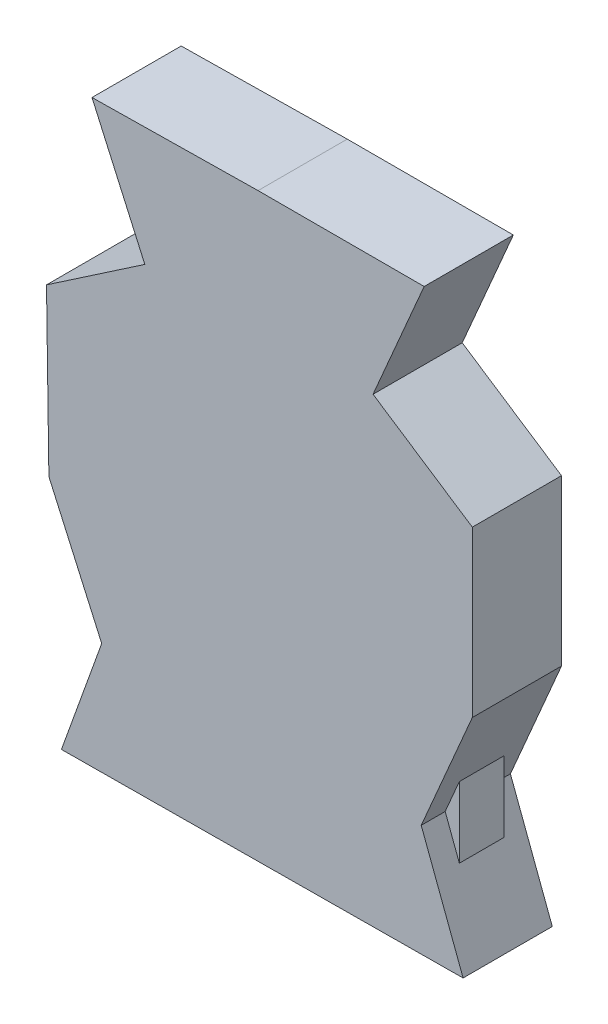
ISO-10303-21;
HEADER;
FILE_DESCRIPTION(('STEP AP214'),'2;1');
FILE_NAME('part.step','',(''),(''),'','','');
FILE_SCHEMA(('AUTOMOTIVE_DESIGN { 1 0 10303 214 1 1 1 1 }'));
ENDSEC;
DATA;
#1=APPLICATION_CONTEXT('core data for automotive mechanical design processes');
#2=APPLICATION_PROTOCOL_DEFINITION('international standard','automotive_design',2000,#1);
#3=PRODUCT_CONTEXT('',#1,'mechanical');
#4=PRODUCT('Part','Part','',(#3));
#5=PRODUCT_RELATED_PRODUCT_CATEGORY('part','',(#4));
#6=PRODUCT_DEFINITION_FORMATION('','',#4);
#7=PRODUCT_DEFINITION_CONTEXT('part definition',#1,'design');
#8=PRODUCT_DEFINITION('design','',#6,#7);
#9=PRODUCT_DEFINITION_SHAPE('','',#8);
#10=(LENGTH_UNIT() NAMED_UNIT(*) SI_UNIT(.MILLI.,.METRE.));
#11=(NAMED_UNIT(*) PLANE_ANGLE_UNIT() SI_UNIT($,.RADIAN.));
#12=(NAMED_UNIT(*) SI_UNIT($,.STERADIAN.) SOLID_ANGLE_UNIT());
#13=UNCERTAINTY_MEASURE_WITH_UNIT(LENGTH_MEASURE(1.E-05),#10,'distance_accuracy_value','');
#14=(GEOMETRIC_REPRESENTATION_CONTEXT(3) GLOBAL_UNCERTAINTY_ASSIGNED_CONTEXT((#13)) GLOBAL_UNIT_ASSIGNED_CONTEXT((#10,
#11,#12)) REPRESENTATION_CONTEXT('',''));
#15=CARTESIAN_POINT('',(0.,0.,0.));
#16=DIRECTION('',(0.,0.,1.));
#17=DIRECTION('',(1.,0.,0.));
#18=AXIS2_PLACEMENT_3D('',#15,#16,#17);
#19=CARTESIAN_POINT('',(19.2258651036182,-108.485610583333,30.));
#20=DIRECTION('',(-0.935884627526308,-0.352306633431652,0.));
#21=DIRECTION('',(0.352306633431652,-0.935884627526308,0.));
#22=AXIS2_PLACEMENT_3D('',#19,#20,#21);
#23=PLANE('',#22);
#24=DIRECTION('',(-0.352306633431652,0.935884627526308,0.));
#25=VECTOR('',#24,1.);
#26=CARTESIAN_POINT('',(19.2258651036182,-108.485610583333,6.94150678656227));
#27=LINE('',#26,#25);
#28=CARTESIAN_POINT('',(24.0000000000001,-121.167856772511,6.94150678656227));
#29=VERTEX_POINT('',#28);
#30=CARTESIAN_POINT('',(19.2258651036182,-108.485610583333,6.94150678656227));
#31=VERTEX_POINT('',#30);
#32=EDGE_CURVE('E48',#29,#31,#27,.T.);
#33=ORIENTED_EDGE('',*,*,#32,.F.);
#34=DIRECTION('',(0.,0.,-1.));
#35=VECTOR('',#34,1.);
#36=CARTESIAN_POINT('',(24.0000000000001,-121.167856772511,30.));
#37=LINE('',#36,#35);
#38=CARTESIAN_POINT('',(24.0000000000001,-121.167856772511,21.9415067865623));
#39=VERTEX_POINT('',#38);
#40=EDGE_CURVE('E52',#39,#29,#37,.T.);
#41=ORIENTED_EDGE('',*,*,#40,.F.);
#42=DIRECTION('',(0.352306633431652,-0.935884627526308,0.));
#43=VECTOR('',#42,1.);
#44=CARTESIAN_POINT('',(19.2258651036182,-108.485610583333,21.9415067865623));
#45=LINE('',#44,#43);
#46=CARTESIAN_POINT('',(19.2258651036182,-108.485610583333,21.9415067865623));
#47=VERTEX_POINT('',#46);
#48=EDGE_CURVE('E163',#47,#39,#45,.T.);
#49=ORIENTED_EDGE('',*,*,#48,.F.);
#50=DIRECTION('',(0.,0.,-1.));
#51=VECTOR('',#50,1.);
#52=CARTESIAN_POINT('',(19.2258651036182,-108.485610583333,30.));
#53=LINE('',#52,#51);
#54=CARTESIAN_POINT('',(19.2258651036182,-108.485610583333,30.));
#55=VERTEX_POINT('',#54);
#56=EDGE_CURVE('E150',#55,#47,#53,.T.);
#57=ORIENTED_EDGE('',*,*,#56,.F.);
#58=DIRECTION('',(-0.352306633431652,0.935884627526308,0.));
#59=VECTOR('',#58,1.);
#60=CARTESIAN_POINT('',(19.2258651036182,-108.485610583333,30.));
#61=LINE('',#60,#59);
#62=CARTESIAN_POINT('',(33.3181304408842,-145.920995684385,30.));
#63=VERTEX_POINT('',#62);
#64=EDGE_CURVE('E187',#63,#55,#61,.T.);
#65=ORIENTED_EDGE('',*,*,#64,.F.);
#66=DIRECTION('',(0.,0.,-1.));
#67=VECTOR('',#66,1.);
#68=CARTESIAN_POINT('',(33.3181304408842,-145.920995684385,30.));
#69=LINE('',#68,#67);
#70=CARTESIAN_POINT('',(33.3181304408842,-145.920995684385,0.));
#71=VERTEX_POINT('',#70);
#72=EDGE_CURVE('E242',#63,#71,#69,.T.);
#73=ORIENTED_EDGE('',*,*,#72,.T.);
#74=DIRECTION('',(-0.352306633431652,0.935884627526308,0.));
#75=VECTOR('',#74,1.);
#76=CARTESIAN_POINT('',(19.2258651036182,-108.485610583333,0.));
#77=LINE('',#76,#75);
#78=CARTESIAN_POINT('',(19.2258651036182,-108.485610583333,0.));
#79=VERTEX_POINT('',#78);
#80=EDGE_CURVE('E214',#71,#79,#77,.T.);
#81=ORIENTED_EDGE('',*,*,#80,.T.);
#82=EDGE_CURVE('E240',#31,#79,#53,.T.);
#83=ORIENTED_EDGE('',*,*,#82,.F.);
#84=EDGE_LOOP('',(#33,#41,#49,#57,#65,#73,#81,#83));
#85=FACE_BOUND('',#84,.T.);
#86=ADVANCED_FACE('F33',(#85),#23,.F.);
#87=CARTESIAN_POINT('',(36.4175876407539,-68.4856105833332,30.));
#88=DIRECTION('',(-0.918738168273325,0.394867291830782,0.));
#89=DIRECTION('',(-0.394867291830782,-0.918738168273325,0.));
#90=AXIS2_PLACEMENT_3D('',#87,#88,#89);
#91=PLANE('',#90);
#92=DIRECTION('',(0.394867291830782,0.918738168273325,0.));
#93=VECTOR('',#92,1.);
#94=CARTESIAN_POINT('',(36.4175876407539,-68.4856105833332,6.94150678656227));
#95=LINE('',#94,#93);
#96=CARTESIAN_POINT('',(24.0000000000001,-97.377625595629,6.94150678656227));
#97=VERTEX_POINT('',#96);
#98=EDGE_CURVE('E11',#31,#97,#95,.T.);
#99=ORIENTED_EDGE('',*,*,#98,.F.);
#100=ORIENTED_EDGE('',*,*,#82,.T.);
#101=DIRECTION('',(0.394867291830782,0.918738168273325,0.));
#102=VECTOR('',#101,1.);
#103=CARTESIAN_POINT('',(36.4175876407539,-68.4856105833332,0.));
#104=LINE('',#103,#102);
#105=CARTESIAN_POINT('',(36.4175876407539,-68.4856105833332,0.));
#106=VERTEX_POINT('',#105);
#107=EDGE_CURVE('E217',#79,#106,#104,.T.);
#108=ORIENTED_EDGE('',*,*,#107,.T.);
#109=DIRECTION('',(0.,0.,-1.));
#110=VECTOR('',#109,1.);
#111=CARTESIAN_POINT('',(36.4175876407539,-68.4856105833332,30.));
#112=LINE('',#111,#110);
#113=CARTESIAN_POINT('',(36.4175876407539,-68.4856105833332,30.));
#114=VERTEX_POINT('',#113);
#115=EDGE_CURVE('E237',#114,#106,#112,.T.);
#116=ORIENTED_EDGE('',*,*,#115,.F.);
#117=DIRECTION('',(0.394867291830782,0.918738168273325,0.));
#118=VECTOR('',#117,1.);
#119=CARTESIAN_POINT('',(36.4175876407539,-68.4856105833332,30.));
#120=LINE('',#119,#118);
#121=EDGE_CURVE('E189',#55,#114,#120,.T.);
#122=ORIENTED_EDGE('',*,*,#121,.F.);
#123=ORIENTED_EDGE('',*,*,#56,.T.);
#124=DIRECTION('',(-0.394867291830782,-0.918738168273325,0.));
#125=VECTOR('',#124,1.);
#126=CARTESIAN_POINT('',(36.4175876407539,-68.4856105833332,21.9415067865623));
#127=LINE('',#126,#125);
#128=CARTESIAN_POINT('',(24.0000000000001,-97.377625595629,21.9415067865623));
#129=VERTEX_POINT('',#128);
#130=EDGE_CURVE('E41',#129,#47,#127,.T.);
#131=ORIENTED_EDGE('',*,*,#130,.F.);
#132=DIRECTION('',(0.,0.,1.));
#133=VECTOR('',#132,1.);
#134=CARTESIAN_POINT('',(24.0000000000001,-97.377625595629,30.));
#135=LINE('',#134,#133);
#136=EDGE_CURVE('E147',#97,#129,#135,.T.);
#137=ORIENTED_EDGE('',*,*,#136,.F.);
#138=EDGE_LOOP('',(#99,#100,#108,#116,#122,#123,#131,#137));
#139=FACE_BOUND('',#138,.T.);
#140=ADVANCED_FACE('F146',(#139),#91,.F.);
#141=CARTESIAN_POINT('',(-91.5246396923902,48.1857808875972,30.));
#142=DIRECTION('',(0.0144687106700426,-0.999895322727107,0.));
#143=DIRECTION('',(0.999895322727108,0.0144687106700426,0.));
#144=AXIS2_PLACEMENT_3D('',#141,#142,#143);
#145=PLANE('',#144);
#146=DIRECTION('',(-0.999895322727107,-0.0144687106700426,0.));
#147=VECTOR('',#146,1.);
#148=CARTESIAN_POINT('',(-91.5246396923902,48.1857808875972,0.));
#149=LINE('',#148,#147);
#150=CARTESIAN_POINT('',(-35.6592204405538,48.9941660947716,0.));
#151=VERTEX_POINT('',#150);
#152=CARTESIAN_POINT('',(-91.5246396923902,48.1857808875972,0.));
#153=VERTEX_POINT('',#152);
#154=EDGE_CURVE('E170',#151,#153,#149,.T.);
#155=ORIENTED_EDGE('',*,*,#154,.T.);
#156=DIRECTION('',(0.,0.,-1.));
#157=VECTOR('',#156,1.);
#158=CARTESIAN_POINT('',(-91.5246396923902,48.1857808875972,30.));
#159=LINE('',#158,#157);
#160=CARTESIAN_POINT('',(-91.5246396923902,48.1857808875972,30.));
#161=VERTEX_POINT('',#160);
#162=EDGE_CURVE('E160',#161,#153,#159,.T.);
#163=ORIENTED_EDGE('',*,*,#162,.F.);
#164=DIRECTION('',(-0.999895322727107,-0.0144687106700426,0.));
#165=VECTOR('',#164,1.);
#166=CARTESIAN_POINT('',(-91.5246396923902,48.1857808875972,30.));
#167=LINE('',#166,#165);
#168=CARTESIAN_POINT('',(-35.6592204405538,48.9941660947716,30.));
#169=VERTEX_POINT('',#168);
#170=EDGE_CURVE('E171',#169,#161,#167,.T.);
#171=ORIENTED_EDGE('',*,*,#170,.F.);
#172=DIRECTION('',(0.,0.,-1.));
#173=VECTOR('',#172,1.);
#174=CARTESIAN_POINT('',(-35.6592204405538,48.9941660947716,30.));
#175=LINE('',#174,#173);
#176=EDGE_CURVE('E199',#169,#151,#175,.T.);
#177=ORIENTED_EDGE('',*,*,#176,.T.);
#178=EDGE_LOOP('',(#155,#163,#171,#177));
#179=FACE_BOUND('',#178,.T.);
#180=ADVANCED_FACE('F35',(#179),#145,.F.);
#181=CARTESIAN_POINT('',(-91.5246396923902,48.1857808875972,30.));
#182=DIRECTION('',(0.912928776668804,0.408118914937791,0.));
#183=DIRECTION('',(-0.408118914937791,0.912928776668805,0.));
#184=AXIS2_PLACEMENT_3D('',#181,#182,#183);
#185=PLANE('',#184);
#186=DIRECTION('',(0.408118914937791,-0.912928776668804,0.));
#187=VECTOR('',#186,1.);
#188=CARTESIAN_POINT('',(-91.5246396923902,48.1857808875972,0.));
#189=LINE('',#188,#187);
#190=CARTESIAN_POINT('',(-73.7559683110842,8.43871003782237,0.));
#191=VERTEX_POINT('',#190);
#192=EDGE_CURVE('E202',#153,#191,#189,.T.);
#193=ORIENTED_EDGE('',*,*,#192,.T.);
#194=DIRECTION('',(0.,0.,-1.));
#195=VECTOR('',#194,1.);
#196=CARTESIAN_POINT('',(-73.7559683110842,8.43871003782237,30.));
#197=LINE('',#196,#195);
#198=CARTESIAN_POINT('',(-73.7559683110842,8.43871003782237,30.));
#199=VERTEX_POINT('',#198);
#200=EDGE_CURVE('E257',#199,#191,#197,.T.);
#201=ORIENTED_EDGE('',*,*,#200,.F.);
#202=DIRECTION('',(0.408118914937791,-0.912928776668804,0.));
#203=VECTOR('',#202,1.);
#204=CARTESIAN_POINT('',(-91.5246396923902,48.1857808875972,30.));
#205=LINE('',#204,#203);
#206=EDGE_CURVE('E174',#161,#199,#205,.T.);
#207=ORIENTED_EDGE('',*,*,#206,.F.);
#208=ORIENTED_EDGE('',*,*,#162,.T.);
#209=EDGE_LOOP('',(#193,#201,#207,#208));
#210=FACE_BOUND('',#209,.T.);
#211=ADVANCED_FACE('F263',(#210),#185,.F.);
#212=CARTESIAN_POINT('',(-73.7559683110842,8.43871003782237,30.));
#213=DIRECTION('',(0.562376540625002,-0.82688126508868,0.));
#214=DIRECTION('',(0.82688126508868,0.562376540625002,0.));
#215=AXIS2_PLACEMENT_3D('',#212,#213,#214);
#216=PLANE('',#215);
#217=DIRECTION('',(-0.82688126508868,-0.562376540625002,0.));
#218=VECTOR('',#217,1.);
#219=CARTESIAN_POINT('',(-73.7559683110842,8.43871003782237,0.));
#220=LINE('',#219,#218);
#221=CARTESIAN_POINT('',(-106.831218914631,-14.0563515871777,0.));
#222=VERTEX_POINT('',#221);
#223=EDGE_CURVE('E204',#191,#222,#220,.T.);
#224=ORIENTED_EDGE('',*,*,#223,.T.);
#225=DIRECTION('',(0.,0.,-1.));
#226=VECTOR('',#225,1.);
#227=CARTESIAN_POINT('',(-106.831218914631,-14.0563515871777,30.));
#228=LINE('',#227,#226);
#229=CARTESIAN_POINT('',(-106.831218914631,-14.0563515871777,30.));
#230=VERTEX_POINT('',#229);
#231=EDGE_CURVE('E254',#230,#222,#228,.T.);
#232=ORIENTED_EDGE('',*,*,#231,.F.);
#233=DIRECTION('',(-0.82688126508868,-0.562376540625002,0.));
#234=VECTOR('',#233,1.);
#235=CARTESIAN_POINT('',(-73.7559683110842,8.43871003782237,30.));
#236=LINE('',#235,#234);
#237=EDGE_CURVE('E177',#199,#230,#236,.T.);
#238=ORIENTED_EDGE('',*,*,#237,.F.);
#239=ORIENTED_EDGE('',*,*,#200,.T.);
#240=EDGE_LOOP('',(#224,#232,#238,#239));
#241=FACE_BOUND('',#240,.T.);
#242=ADVANCED_FACE('F278',(#241),#216,.F.);
#243=CARTESIAN_POINT('',(-106.831218914631,-14.0563515871777,30.));
#244=DIRECTION('',(0.999895322727108,0.0144687106700407,0.));
#245=DIRECTION('',(-0.0144687106700407,0.999895322727108,0.));
#246=AXIS2_PLACEMENT_3D('',#243,#244,#245);
#247=PLANE('',#246);
#248=DIRECTION('',(0.0144687106700407,-0.999895322727108,0.));
#249=VECTOR('',#248,1.);
#250=CARTESIAN_POINT('',(-106.831218914631,-14.0563515871777,0.));
#251=LINE('',#250,#249);
#252=CARTESIAN_POINT('',(-106.028702819816,-69.5161716028391,0.));
#253=VERTEX_POINT('',#252);
#254=EDGE_CURVE('E206',#222,#253,#251,.T.);
#255=ORIENTED_EDGE('',*,*,#254,.T.);
#256=DIRECTION('',(0.,0.,-1.));
#257=VECTOR('',#256,1.);
#258=CARTESIAN_POINT('',(-106.028702819816,-69.5161716028391,30.));
#259=LINE('',#258,#257);
#260=CARTESIAN_POINT('',(-106.028702819816,-69.5161716028391,30.));
#261=VERTEX_POINT('',#260);
#262=EDGE_CURVE('E251',#261,#253,#259,.T.);
#263=ORIENTED_EDGE('',*,*,#262,.F.);
#264=DIRECTION('',(0.0144687106700407,-0.999895322727108,0.));
#265=VECTOR('',#264,1.);
#266=CARTESIAN_POINT('',(-106.831218914631,-14.0563515871777,30.));
#267=LINE('',#266,#265);
#268=EDGE_CURVE('E179',#230,#261,#267,.T.);
#269=ORIENTED_EDGE('',*,*,#268,.F.);
#270=ORIENTED_EDGE('',*,*,#231,.T.);
#271=EDGE_LOOP('',(#255,#263,#269,#270));
#272=FACE_BOUND('',#271,.T.);
#273=ADVANCED_FACE('F282',(#272),#247,.F.);
#274=CARTESIAN_POINT('',(-106.028702819816,-69.5161716028391,30.));
#275=DIRECTION('',(0.912928776668805,0.408118914937791,0.));
#276=DIRECTION('',(-0.408118914937791,0.912928776668805,0.));
#277=AXIS2_PLACEMENT_3D('',#274,#275,#276);
#278=PLANE('',#277);
#279=DIRECTION('',(0.408118914937791,-0.912928776668805,0.));
#280=VECTOR('',#279,1.);
#281=CARTESIAN_POINT('',(-106.028702819816,-69.5161716028391,0.));
#282=LINE('',#281,#280);
#283=CARTESIAN_POINT('',(-88.2600314385101,-109.263242452614,0.));
#284=VERTEX_POINT('',#283);
#285=EDGE_CURVE('E208',#253,#284,#282,.T.);
#286=ORIENTED_EDGE('',*,*,#285,.T.);
#287=DIRECTION('',(0.,0.,-1.));
#288=VECTOR('',#287,1.);
#289=CARTESIAN_POINT('',(-88.2600314385101,-109.263242452614,30.));
#290=LINE('',#289,#288);
#291=CARTESIAN_POINT('',(-88.2600314385101,-109.263242452614,30.));
#292=VERTEX_POINT('',#291);
#293=EDGE_CURVE('E248',#292,#284,#290,.T.);
#294=ORIENTED_EDGE('',*,*,#293,.F.);
#295=DIRECTION('',(0.408118914937791,-0.912928776668805,0.));
#296=VECTOR('',#295,1.);
#297=CARTESIAN_POINT('',(-106.028702819816,-69.5161716028391,30.));
#298=LINE('',#297,#296);
#299=EDGE_CURVE('E181',#261,#292,#298,.T.);
#300=ORIENTED_EDGE('',*,*,#299,.F.);
#301=ORIENTED_EDGE('',*,*,#262,.T.);
#302=EDGE_LOOP('',(#286,#294,#300,#301));
#303=FACE_BOUND('',#302,.T.);
#304=ADVANCED_FACE('F320',(#303),#278,.F.);
#305=CARTESIAN_POINT('',(-88.2600314385101,-109.263242452614,30.));
#306=DIRECTION('',(0.940884084422016,-0.338728711037824,0.));
#307=DIRECTION('',(0.338728711037824,0.940884084422016,0.));
#308=AXIS2_PLACEMENT_3D('',#305,#306,#307);
#309=PLANE('',#308);
#310=DIRECTION('',(-0.338728711037824,-0.940884084422016,0.));
#311=VECTOR('',#310,1.);
#312=CARTESIAN_POINT('',(-88.2600314385101,-109.263242452614,0.));
#313=LINE('',#312,#311);
#314=CARTESIAN_POINT('',(-101.809179880023,-146.898605829495,0.));
#315=VERTEX_POINT('',#314);
#316=EDGE_CURVE('E210',#284,#315,#313,.T.);
#317=ORIENTED_EDGE('',*,*,#316,.T.);
#318=DIRECTION('',(0.,0.,-1.));
#319=VECTOR('',#318,1.);
#320=CARTESIAN_POINT('',(-101.809179880023,-146.898605829495,30.));
#321=LINE('',#320,#319);
#322=CARTESIAN_POINT('',(-101.809179880023,-146.898605829495,30.));
#323=VERTEX_POINT('',#322);
#324=EDGE_CURVE('E245',#323,#315,#321,.T.);
#325=ORIENTED_EDGE('',*,*,#324,.F.);
#326=DIRECTION('',(-0.338728711037824,-0.940884084422016,0.));
#327=VECTOR('',#326,1.);
#328=CARTESIAN_POINT('',(-88.2600314385101,-109.263242452614,30.));
#329=LINE('',#328,#327);
#330=EDGE_CURVE('E183',#292,#323,#329,.T.);
#331=ORIENTED_EDGE('',*,*,#330,.F.);
#332=ORIENTED_EDGE('',*,*,#293,.T.);
#333=EDGE_LOOP('',(#317,#325,#331,#332));
#334=FACE_BOUND('',#333,.T.);
#335=ADVANCED_FACE('F318',(#334),#309,.F.);
#336=CARTESIAN_POINT('',(-101.809179880023,-146.898605829495,30.));
#337=DIRECTION('',(-0.00723454466060004,0.999973830339351,0.));
#338=DIRECTION('',(-0.999973830339351,-0.00723454466060004,0.));
#339=AXIS2_PLACEMENT_3D('',#336,#337,#338);
#340=PLANE('',#339);
#341=DIRECTION('',(0.999973830339351,0.00723454466060004,0.));
#342=VECTOR('',#341,1.);
#343=CARTESIAN_POINT('',(-101.809179880023,-146.898605829495,0.));
#344=LINE('',#343,#342);
#345=EDGE_CURVE('E212',#315,#71,#344,.T.);
#346=ORIENTED_EDGE('',*,*,#345,.T.);
#347=ORIENTED_EDGE('',*,*,#72,.F.);
#348=DIRECTION('',(0.999973830339351,0.00723454466060004,0.));
#349=VECTOR('',#348,1.);
#350=CARTESIAN_POINT('',(-101.809179880023,-146.898605829495,30.));
#351=LINE('',#350,#349);
#352=EDGE_CURVE('E185',#323,#63,#351,.T.);
#353=ORIENTED_EDGE('',*,*,#352,.F.);
#354=ORIENTED_EDGE('',*,*,#324,.T.);
#355=EDGE_LOOP('',(#346,#347,#353,#354));
#356=FACE_BOUND('',#355,.T.);
#357=ADVANCED_FACE('F314',(#356),#340,.F.);
#358=CARTESIAN_POINT('',(36.4175876407538,-13.0199845772022,30.));
#359=DIRECTION('',(-1.,0.,0.));
#360=DIRECTION('',(0.,-1.,0.));
#361=AXIS2_PLACEMENT_3D('',#358,#359,#360);
#362=PLANE('',#361);
#363=DIRECTION('',(0.,1.,0.));
#364=VECTOR('',#363,1.);
#365=CARTESIAN_POINT('',(36.4175876407538,-13.0199845772022,0.));
#366=LINE('',#365,#364);
#367=CARTESIAN_POINT('',(36.4175876407538,-13.0199845772022,0.));
#368=VERTEX_POINT('',#367);
#369=EDGE_CURVE('E219',#106,#368,#366,.T.);
#370=ORIENTED_EDGE('',*,*,#369,.T.);
#371=DIRECTION('',(0.,0.,-1.));
#372=VECTOR('',#371,1.);
#373=CARTESIAN_POINT('',(36.4175876407538,-13.0199845772022,30.));
#374=LINE('',#373,#372);
#375=CARTESIAN_POINT('',(36.4175876407538,-13.0199845772022,30.));
#376=VERTEX_POINT('',#375);
#377=EDGE_CURVE('E234',#376,#368,#374,.T.);
#378=ORIENTED_EDGE('',*,*,#377,.F.);
#379=DIRECTION('',(0.,1.,0.));
#380=VECTOR('',#379,1.);
#381=CARTESIAN_POINT('',(36.4175876407538,-13.0199845772022,30.));
#382=LINE('',#381,#380);
#383=EDGE_CURVE('E191',#114,#376,#382,.T.);
#384=ORIENTED_EDGE('',*,*,#383,.F.);
#385=ORIENTED_EDGE('',*,*,#115,.T.);
#386=EDGE_LOOP('',(#370,#378,#384,#385));
#387=FACE_BOUND('',#386,.T.);
#388=ADVANCED_FACE('F305',(#387),#362,.F.);
#389=CARTESIAN_POINT('',(3.02032472608309,8.99416609477159,30.));
#390=DIRECTION('',(-0.550353766799344,-0.834931572866767,0.));
#391=DIRECTION('',(0.834931572866767,-0.550353766799344,0.));
#392=AXIS2_PLACEMENT_3D('',#389,#390,#391);
#393=PLANE('',#392);
#394=DIRECTION('',(-0.834931572866767,0.550353766799344,0.));
#395=VECTOR('',#394,1.);
#396=CARTESIAN_POINT('',(3.02032472608309,8.99416609477159,0.));
#397=LINE('',#396,#395);
#398=CARTESIAN_POINT('',(3.02032472608309,8.99416609477159,0.));
#399=VERTEX_POINT('',#398);
#400=EDGE_CURVE('E221',#368,#399,#397,.T.);
#401=ORIENTED_EDGE('',*,*,#400,.T.);
#402=DIRECTION('',(0.,0.,-1.));
#403=VECTOR('',#402,1.);
#404=CARTESIAN_POINT('',(3.02032472608309,8.99416609477159,30.));
#405=LINE('',#404,#403);
#406=CARTESIAN_POINT('',(3.02032472608309,8.99416609477159,30.));
#407=VERTEX_POINT('',#406);
#408=EDGE_CURVE('E231',#407,#399,#405,.T.);
#409=ORIENTED_EDGE('',*,*,#408,.F.);
#410=DIRECTION('',(-0.834931572866767,0.550353766799344,0.));
#411=VECTOR('',#410,1.);
#412=CARTESIAN_POINT('',(3.02032472608309,8.99416609477159,30.));
#413=LINE('',#412,#411);
#414=EDGE_CURVE('E193',#376,#407,#413,.T.);
#415=ORIENTED_EDGE('',*,*,#414,.F.);
#416=ORIENTED_EDGE('',*,*,#377,.T.);
#417=EDGE_LOOP('',(#401,#409,#415,#416));
#418=FACE_BOUND('',#417,.T.);
#419=ADVANCED_FACE('F300',(#418),#393,.F.);
#420=CARTESIAN_POINT('',(20.2120472632188,48.9941660947716,30.));
#421=DIRECTION('',(-0.918738168273324,0.394867291830783,0.));
#422=DIRECTION('',(-0.394867291830783,-0.918738168273325,0.));
#423=AXIS2_PLACEMENT_3D('',#420,#421,#422);
#424=PLANE('',#423);
#425=DIRECTION('',(0.394867291830783,0.918738168273324,0.));
#426=VECTOR('',#425,1.);
#427=CARTESIAN_POINT('',(20.2120472632188,48.9941660947716,0.));
#428=LINE('',#427,#426);
#429=CARTESIAN_POINT('',(20.2120472632188,48.9941660947716,0.));
#430=VERTEX_POINT('',#429);
#431=EDGE_CURVE('E223',#399,#430,#428,.T.);
#432=ORIENTED_EDGE('',*,*,#431,.T.);
#433=DIRECTION('',(0.,0.,-1.));
#434=VECTOR('',#433,1.);
#435=CARTESIAN_POINT('',(20.2120472632188,48.9941660947716,30.));
#436=LINE('',#435,#434);
#437=CARTESIAN_POINT('',(20.2120472632188,48.9941660947716,30.));
#438=VERTEX_POINT('',#437);
#439=EDGE_CURVE('E228',#438,#430,#436,.T.);
#440=ORIENTED_EDGE('',*,*,#439,.F.);
#441=DIRECTION('',(0.394867291830783,0.918738168273324,0.));
#442=VECTOR('',#441,1.);
#443=CARTESIAN_POINT('',(20.2120472632188,48.9941660947716,30.));
#444=LINE('',#443,#442);
#445=EDGE_CURVE('E195',#407,#438,#444,.T.);
#446=ORIENTED_EDGE('',*,*,#445,.F.);
#447=ORIENTED_EDGE('',*,*,#408,.T.);
#448=EDGE_LOOP('',(#432,#440,#446,#447));
#449=FACE_BOUND('',#448,.T.);
#450=ADVANCED_FACE('F294',(#449),#424,.F.);
#451=CARTESIAN_POINT('',(-35.6592204405538,48.9941660947716,30.));
#452=DIRECTION('',(0.,-1.,0.));
#453=DIRECTION('',(0.,0.,-1.));
#454=AXIS2_PLACEMENT_3D('',#451,#452,#453);
#455=PLANE('',#454);
#456=DIRECTION('',(-1.,0.,0.));
#457=VECTOR('',#456,1.);
#458=CARTESIAN_POINT('',(-35.6592204405538,48.9941660947716,0.));
#459=LINE('',#458,#457);
#460=EDGE_CURVE('E175',#430,#151,#459,.T.);
#461=ORIENTED_EDGE('',*,*,#460,.T.);
#462=ORIENTED_EDGE('',*,*,#176,.F.);
#463=DIRECTION('',(-1.,0.,0.));
#464=VECTOR('',#463,1.);
#465=CARTESIAN_POINT('',(-35.6592204405538,48.9941660947716,30.));
#466=LINE('',#465,#464);
#467=EDGE_CURVE('E197',#438,#169,#466,.T.);
#468=ORIENTED_EDGE('',*,*,#467,.F.);
#469=ORIENTED_EDGE('',*,*,#439,.T.);
#470=EDGE_LOOP('',(#461,#462,#468,#469));
#471=FACE_BOUND('',#470,.T.);
#472=ADVANCED_FACE('F292',(#471),#455,.F.);
#473=CARTESIAN_POINT('',(0.,0.,30.));
#474=DIRECTION('',(0.,0.,-1.));
#475=DIRECTION('',(-1.,0.,0.));
#476=AXIS2_PLACEMENT_3D('',#473,#474,#475);
#477=PLANE('',#476);
#478=ORIENTED_EDGE('',*,*,#170,.T.);
#479=ORIENTED_EDGE('',*,*,#206,.T.);
#480=ORIENTED_EDGE('',*,*,#237,.T.);
#481=ORIENTED_EDGE('',*,*,#268,.T.);
#482=ORIENTED_EDGE('',*,*,#299,.T.);
#483=ORIENTED_EDGE('',*,*,#330,.T.);
#484=ORIENTED_EDGE('',*,*,#352,.T.);
#485=ORIENTED_EDGE('',*,*,#64,.T.);
#486=ORIENTED_EDGE('',*,*,#121,.T.);
#487=ORIENTED_EDGE('',*,*,#383,.T.);
#488=ORIENTED_EDGE('',*,*,#414,.T.);
#489=ORIENTED_EDGE('',*,*,#445,.T.);
#490=ORIENTED_EDGE('',*,*,#467,.T.);
#491=EDGE_LOOP('',(#478,#479,#480,#481,#482,#483,#484,#485,#486,#487,#488,#489,#490));
#492=FACE_BOUND('',#491,.T.);
#493=ADVANCED_FACE('F286',(#492),#477,.F.);
#494=CARTESIAN_POINT('',(0.,0.,0.));
#495=DIRECTION('',(0.,0.,-1.));
#496=DIRECTION('',(-1.,0.,0.));
#497=AXIS2_PLACEMENT_3D('',#494,#495,#496);
#498=PLANE('',#497);
#499=ORIENTED_EDGE('',*,*,#154,.F.);
#500=ORIENTED_EDGE('',*,*,#460,.F.);
#501=ORIENTED_EDGE('',*,*,#431,.F.);
#502=ORIENTED_EDGE('',*,*,#400,.F.);
#503=ORIENTED_EDGE('',*,*,#369,.F.);
#504=ORIENTED_EDGE('',*,*,#107,.F.);
#505=ORIENTED_EDGE('',*,*,#80,.F.);
#506=ORIENTED_EDGE('',*,*,#345,.F.);
#507=ORIENTED_EDGE('',*,*,#316,.F.);
#508=ORIENTED_EDGE('',*,*,#285,.F.);
#509=ORIENTED_EDGE('',*,*,#254,.F.);
#510=ORIENTED_EDGE('',*,*,#223,.F.);
#511=ORIENTED_EDGE('',*,*,#192,.F.);
#512=EDGE_LOOP('',(#499,#500,#501,#502,#503,#504,#505,#506,#507,#508,#509,#510,#511));
#513=FACE_BOUND('',#512,.T.);
#514=ADVANCED_FACE('F271',(#513),#498,.T.);
#515=CARTESIAN_POINT('',(24.0000000000001,-93.5713704018408,6.94150678656227));
#516=DIRECTION('',(0.,0.,1.));
#517=DIRECTION('',(0.,-1.,0.));
#518=AXIS2_PLACEMENT_3D('',#515,#516,#517);
#519=PLANE('',#518);
#520=DIRECTION('',(0.,1.,0.));
#521=VECTOR('',#520,1.);
#522=CARTESIAN_POINT('',(24.0000000000001,-93.5713704018408,6.94150678656227));
#523=LINE('',#522,#521);
#524=EDGE_CURVE('E159',#29,#97,#523,.T.);
#525=ORIENTED_EDGE('',*,*,#524,.F.);
#526=ORIENTED_EDGE('',*,*,#32,.T.);
#527=ORIENTED_EDGE('',*,*,#98,.T.);
#528=EDGE_LOOP('',(#525,#526,#527));
#529=FACE_BOUND('',#528,.T.);
#530=ADVANCED_FACE('F352',(#529),#519,.F.);
#531=CARTESIAN_POINT('',(24.0000000000001,-93.5713704018408,21.9415067865623));
#532=DIRECTION('',(0.,0.,-1.));
#533=DIRECTION('',(0.,1.,0.));
#534=AXIS2_PLACEMENT_3D('',#531,#532,#533);
#535=PLANE('',#534);
#536=ORIENTED_EDGE('',*,*,#130,.T.);
#537=ORIENTED_EDGE('',*,*,#48,.T.);
#538=DIRECTION('',(0.,-1.,0.));
#539=VECTOR('',#538,1.);
#540=CARTESIAN_POINT('',(24.0000000000001,-93.5713704018408,21.9415067865623));
#541=LINE('',#540,#539);
#542=EDGE_CURVE('E157',#129,#39,#541,.T.);
#543=ORIENTED_EDGE('',*,*,#542,.F.);
#544=EDGE_LOOP('',(#536,#537,#543));
#545=FACE_BOUND('',#544,.T.);
#546=ADVANCED_FACE('F162',(#545),#535,.F.);
#547=CARTESIAN_POINT('',(24.0000000000001,0.,0.));
#548=DIRECTION('',(-1.,0.,0.));
#549=DIRECTION('',(0.,0.,1.));
#550=AXIS2_PLACEMENT_3D('',#547,#548,#549);
#551=PLANE('',#550);
#552=ORIENTED_EDGE('',*,*,#542,.T.);
#553=ORIENTED_EDGE('',*,*,#40,.T.);
#554=ORIENTED_EDGE('',*,*,#524,.T.);
#555=ORIENTED_EDGE('',*,*,#136,.T.);
#556=EDGE_LOOP('',(#552,#553,#554,#555));
#557=FACE_BOUND('',#556,.T.);
#558=ADVANCED_FACE('F156',(#557),#551,.F.);
#559=CLOSED_SHELL('',(#86,#140,#180,#211,#242,#273,#304,#335,#357,#388,#419,#450,#472,#493,#514,
#530,#546,#558));
#560=MANIFOLD_SOLID_BREP('B2',#559);
#561=ADVANCED_BREP_SHAPE_REPRESENTATION('',(#18,#560),#14);
#562=SHAPE_DEFINITION_REPRESENTATION(#9,#561);
ENDSEC;
END-ISO-10303-21;
